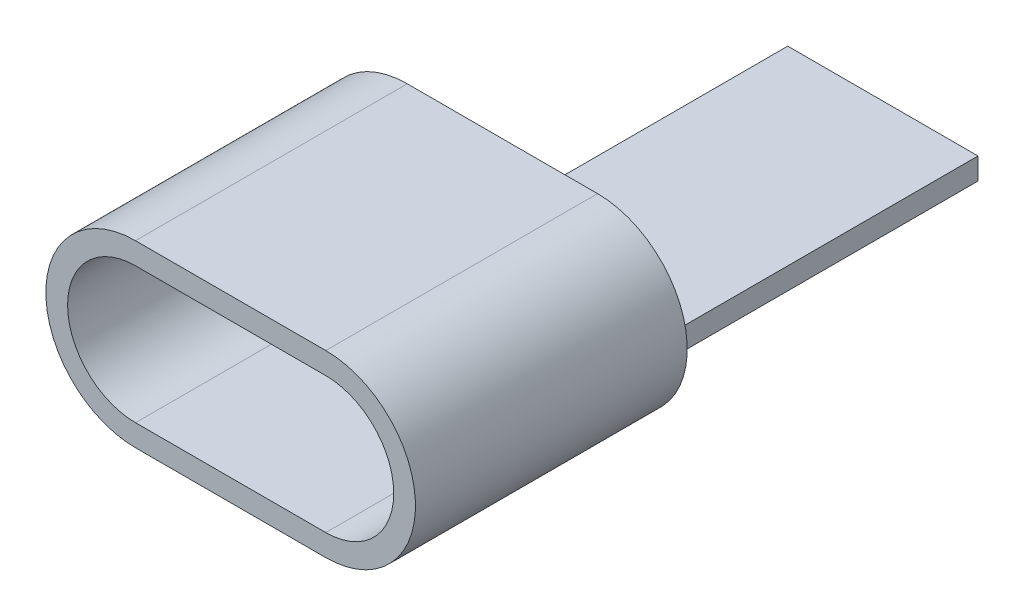
ISO-10303-21;
HEADER;
FILE_DESCRIPTION(('STEP AP214'),'2;1');
FILE_NAME('part.step','',(''),(''),'','','');
FILE_SCHEMA(('AUTOMOTIVE_DESIGN { 1 0 10303 214 1 1 1 1 }'));
ENDSEC;
DATA;
#1=APPLICATION_CONTEXT('core data for automotive mechanical design processes');
#2=APPLICATION_PROTOCOL_DEFINITION('international standard','automotive_design',2000,#1);
#3=PRODUCT_CONTEXT('',#1,'mechanical');
#4=PRODUCT('Part','Part','',(#3));
#5=PRODUCT_RELATED_PRODUCT_CATEGORY('part','',(#4));
#6=PRODUCT_DEFINITION_FORMATION('','',#4);
#7=PRODUCT_DEFINITION_CONTEXT('part definition',#1,'design');
#8=PRODUCT_DEFINITION('design','',#6,#7);
#9=PRODUCT_DEFINITION_SHAPE('','',#8);
#10=(LENGTH_UNIT() NAMED_UNIT(*) SI_UNIT(.MILLI.,.METRE.));
#11=(NAMED_UNIT(*) PLANE_ANGLE_UNIT() SI_UNIT($,.RADIAN.));
#12=(NAMED_UNIT(*) SI_UNIT($,.STERADIAN.) SOLID_ANGLE_UNIT());
#13=UNCERTAINTY_MEASURE_WITH_UNIT(LENGTH_MEASURE(1.E-05),#10,'distance_accuracy_value','');
#14=(GEOMETRIC_REPRESENTATION_CONTEXT(3) GLOBAL_UNCERTAINTY_ASSIGNED_CONTEXT((#13)) GLOBAL_UNIT_ASSIGNED_CONTEXT((#10,
#11,#12)) REPRESENTATION_CONTEXT('',''));
#15=CARTESIAN_POINT('',(0.,0.,0.));
#16=DIRECTION('',(0.,0.,1.));
#17=DIRECTION('',(1.,0.,0.));
#18=AXIS2_PLACEMENT_3D('',#15,#16,#17);
#19=CARTESIAN_POINT('',(-7.00000000000001,1.6,0.));
#20=DIRECTION('',(1.,0.,0.));
#21=DIRECTION('',(0.,0.,-1.));
#22=AXIS2_PLACEMENT_3D('',#19,#20,#21);
#23=PLANE('',#22);
#24=DIRECTION('',(0.,0.,1.));
#25=VECTOR('',#24,1.);
#26=CARTESIAN_POINT('',(-7.00000000000001,0.,0.));
#27=LINE('',#26,#25);
#28=CARTESIAN_POINT('',(-6.99999999999999,0.,-28.));
#29=VERTEX_POINT('',#28);
#30=CARTESIAN_POINT('',(-7.00000000000001,0.,0.));
#31=VERTEX_POINT('',#30);
#32=EDGE_CURVE('E174',#29,#31,#27,.T.);
#33=ORIENTED_EDGE('',*,*,#32,.T.);
#34=DIRECTION('',(0.,-1.,0.));
#35=VECTOR('',#34,1.);
#36=CARTESIAN_POINT('',(-7.00000000000001,1.6,0.));
#37=LINE('',#36,#35);
#38=CARTESIAN_POINT('',(-7.00000000000001,1.6,0.));
#39=VERTEX_POINT('',#38);
#40=EDGE_CURVE('E11',#39,#31,#37,.T.);
#41=ORIENTED_EDGE('',*,*,#40,.F.);
#42=DIRECTION('',(0.,0.,1.));
#43=VECTOR('',#42,1.);
#44=CARTESIAN_POINT('',(-7.00000000000001,1.6,0.));
#45=LINE('',#44,#43);
#46=CARTESIAN_POINT('',(-6.99999999999999,1.6,-28.));
#47=VERTEX_POINT('',#46);
#48=EDGE_CURVE('E83',#47,#39,#45,.T.);
#49=ORIENTED_EDGE('',*,*,#48,.F.);
#50=DIRECTION('',(0.,-1.,0.));
#51=VECTOR('',#50,1.);
#52=CARTESIAN_POINT('',(-6.99999999999999,1.6,-28.));
#53=LINE('',#52,#51);
#54=EDGE_CURVE('E173',#47,#29,#53,.T.);
#55=ORIENTED_EDGE('',*,*,#54,.T.);
#56=EDGE_LOOP('',(#33,#41,#49,#55));
#57=FACE_BOUND('',#56,.T.);
#58=ADVANCED_FACE('F41',(#57),#23,.F.);
#59=CARTESIAN_POINT('',(7.00000000000001,1.6,0.));
#60=DIRECTION('',(-1.,0.,0.));
#61=DIRECTION('',(0.,0.,1.));
#62=AXIS2_PLACEMENT_3D('',#59,#60,#61);
#63=PLANE('',#62);
#64=DIRECTION('',(0.,0.,-1.));
#65=VECTOR('',#64,1.);
#66=CARTESIAN_POINT('',(7.00000000000001,0.,0.));
#67=LINE('',#66,#65);
#68=CARTESIAN_POINT('',(7.00000000000001,0.,0.));
#69=VERTEX_POINT('',#68);
#70=CARTESIAN_POINT('',(7.00000000000001,0.,-28.));
#71=VERTEX_POINT('',#70);
#72=EDGE_CURVE('E72',#69,#71,#67,.T.);
#73=ORIENTED_EDGE('',*,*,#72,.T.);
#74=DIRECTION('',(0.,-1.,0.));
#75=VECTOR('',#74,1.);
#76=CARTESIAN_POINT('',(7.00000000000001,1.6,-28.));
#77=LINE('',#76,#75);
#78=CARTESIAN_POINT('',(7.00000000000001,1.6,-28.));
#79=VERTEX_POINT('',#78);
#80=EDGE_CURVE('E184',#79,#71,#77,.T.);
#81=ORIENTED_EDGE('',*,*,#80,.F.);
#82=DIRECTION('',(0.,0.,-1.));
#83=VECTOR('',#82,1.);
#84=CARTESIAN_POINT('',(7.00000000000001,1.6,0.));
#85=LINE('',#84,#83);
#86=CARTESIAN_POINT('',(7.00000000000001,1.6,0.));
#87=VERTEX_POINT('',#86);
#88=EDGE_CURVE('E168',#87,#79,#85,.T.);
#89=ORIENTED_EDGE('',*,*,#88,.F.);
#90=DIRECTION('',(0.,-1.,0.));
#91=VECTOR('',#90,1.);
#92=CARTESIAN_POINT('',(7.00000000000001,1.6,0.));
#93=LINE('',#92,#91);
#94=EDGE_CURVE('E50',#87,#69,#93,.T.);
#95=ORIENTED_EDGE('',*,*,#94,.T.);
#96=EDGE_LOOP('',(#73,#81,#89,#95));
#97=FACE_BOUND('',#96,.T.);
#98=ADVANCED_FACE('F188',(#97),#63,.F.);
#99=CARTESIAN_POINT('',(-6.99999999999999,1.6,-28.));
#100=DIRECTION('',(0.,0.,1.));
#101=DIRECTION('',(1.,0.,0.));
#102=AXIS2_PLACEMENT_3D('',#99,#100,#101);
#103=PLANE('',#102);
#104=DIRECTION('',(-1.,0.,0.));
#105=VECTOR('',#104,1.);
#106=CARTESIAN_POINT('',(-6.99999999999999,0.,-28.));
#107=LINE('',#106,#105);
#108=EDGE_CURVE('E78',#71,#29,#107,.T.);
#109=ORIENTED_EDGE('',*,*,#108,.T.);
#110=ORIENTED_EDGE('',*,*,#54,.F.);
#111=DIRECTION('',(-1.,0.,0.));
#112=VECTOR('',#111,1.);
#113=CARTESIAN_POINT('',(-6.99999999999999,1.6,-28.));
#114=LINE('',#113,#112);
#115=EDGE_CURVE('E58',#79,#47,#114,.T.);
#116=ORIENTED_EDGE('',*,*,#115,.F.);
#117=ORIENTED_EDGE('',*,*,#80,.T.);
#118=EDGE_LOOP('',(#109,#110,#116,#117));
#119=FACE_BOUND('',#118,.T.);
#120=ADVANCED_FACE('F265',(#119),#103,.F.);
#121=CARTESIAN_POINT('',(0.,1.6,0.));
#122=DIRECTION('',(0.,-1.,0.));
#123=DIRECTION('',(0.,0.,-1.));
#124=AXIS2_PLACEMENT_3D('',#121,#122,#123);
#125=PLANE('',#124);
#126=ORIENTED_EDGE('',*,*,#48,.T.);
#127=DIRECTION('',(0.,0.,-1.));
#128=VECTOR('',#127,1.);
#129=CARTESIAN_POINT('',(-7.00000000000001,1.6,20.));
#130=LINE('',#129,#128);
#131=CARTESIAN_POINT('',(-7.00000000000001,1.6,20.));
#132=VERTEX_POINT('',#131);
#133=EDGE_CURVE('E177',#132,#39,#130,.T.);
#134=ORIENTED_EDGE('',*,*,#133,.F.);
#135=DIRECTION('',(1.,0.,0.));
#136=VECTOR('',#135,1.);
#137=CARTESIAN_POINT('',(0.,1.6,20.));
#138=LINE('',#137,#136);
#139=CARTESIAN_POINT('',(7.00000000000001,1.6,20.));
#140=VERTEX_POINT('',#139);
#141=EDGE_CURVE('E234',#132,#140,#138,.T.);
#142=ORIENTED_EDGE('',*,*,#141,.T.);
#143=DIRECTION('',(0.,0.,-1.));
#144=VECTOR('',#143,1.);
#145=CARTESIAN_POINT('',(7.00000000000001,1.6,20.));
#146=LINE('',#145,#144);
#147=EDGE_CURVE('E155',#140,#87,#146,.T.);
#148=ORIENTED_EDGE('',*,*,#147,.T.);
#149=ORIENTED_EDGE('',*,*,#88,.T.);
#150=ORIENTED_EDGE('',*,*,#115,.T.);
#151=EDGE_LOOP('',(#126,#134,#142,#148,#149,#150));
#152=FACE_BOUND('',#151,.T.);
#153=ADVANCED_FACE('F264',(#152),#125,.F.);
#154=CARTESIAN_POINT('',(0.,0.,0.));
#155=DIRECTION('',(0.,-1.,0.));
#156=DIRECTION('',(0.,0.,-1.));
#157=AXIS2_PLACEMENT_3D('',#154,#155,#156);
#158=PLANE('',#157);
#159=ORIENTED_EDGE('',*,*,#32,.F.);
#160=ORIENTED_EDGE('',*,*,#108,.F.);
#161=ORIENTED_EDGE('',*,*,#72,.F.);
#162=DIRECTION('',(0.,0.,-1.));
#163=VECTOR('',#162,1.);
#164=CARTESIAN_POINT('',(7.00000000000001,0.,20.));
#165=LINE('',#164,#163);
#166=CARTESIAN_POINT('',(7.00000000000001,0.,20.));
#167=VERTEX_POINT('',#166);
#168=EDGE_CURVE('E134',#167,#69,#165,.T.);
#169=ORIENTED_EDGE('',*,*,#168,.F.);
#170=DIRECTION('',(1.,0.,0.));
#171=VECTOR('',#170,1.);
#172=CARTESIAN_POINT('',(0.,0.,20.));
#173=LINE('',#172,#171);
#174=CARTESIAN_POINT('',(-7.00000000000001,0.,20.));
#175=VERTEX_POINT('',#174);
#176=EDGE_CURVE('E126',#175,#167,#173,.T.);
#177=ORIENTED_EDGE('',*,*,#176,.F.);
#178=DIRECTION('',(0.,0.,-1.));
#179=VECTOR('',#178,1.);
#180=CARTESIAN_POINT('',(-7.00000000000001,0.,20.));
#181=LINE('',#180,#179);
#182=EDGE_CURVE('E131',#175,#31,#181,.T.);
#183=ORIENTED_EDGE('',*,*,#182,.T.);
#184=EDGE_LOOP('',(#159,#160,#161,#169,#177,#183));
#185=FACE_BOUND('',#184,.T.);
#186=ADVANCED_FACE('F129',(#185),#158,.T.);
#187=CARTESIAN_POINT('',(0.,0.,0.));
#188=DIRECTION('',(0.,0.,1.));
#189=DIRECTION('',(1.,0.,0.));
#190=AXIS2_PLACEMENT_3D('',#187,#188,#189);
#191=PLANE('',#190);
#192=ORIENTED_EDGE('',*,*,#94,.F.);
#193=CARTESIAN_POINT('',(7.00000000000001,6.6,0.));
#194=DIRECTION('',(0.,0.,1.));
#195=DIRECTION('',(1.,0.,0.));
#196=AXIS2_PLACEMENT_3D('',#193,#194,#195);
#197=CIRCLE('',#196,5.);
#198=CARTESIAN_POINT('',(7.00000000000001,11.6,0.));
#199=VERTEX_POINT('',#198);
#200=EDGE_CURVE('E149',#87,#199,#197,.T.);
#201=ORIENTED_EDGE('',*,*,#200,.T.);
#202=DIRECTION('',(1.,0.,0.));
#203=VECTOR('',#202,1.);
#204=CARTESIAN_POINT('',(0.,11.6,0.));
#205=LINE('',#204,#203);
#206=CARTESIAN_POINT('',(-7.00000000000001,11.6,0.));
#207=VERTEX_POINT('',#206);
#208=EDGE_CURVE('E213',#207,#199,#205,.T.);
#209=ORIENTED_EDGE('',*,*,#208,.F.);
#210=CARTESIAN_POINT('',(-7.00000000000001,6.6,0.));
#211=DIRECTION('',(0.,0.,1.));
#212=DIRECTION('',(1.,0.,0.));
#213=AXIS2_PLACEMENT_3D('',#210,#211,#212);
#214=CIRCLE('',#213,5.);
#215=EDGE_CURVE('E205',#207,#39,#214,.T.);
#216=ORIENTED_EDGE('',*,*,#215,.T.);
#217=ORIENTED_EDGE('',*,*,#40,.T.);
#218=CARTESIAN_POINT('',(-7.00000000000001,6.6,0.));
#219=DIRECTION('',(0.,0.,1.));
#220=DIRECTION('',(1.,0.,0.));
#221=AXIS2_PLACEMENT_3D('',#218,#219,#220);
#222=CIRCLE('',#221,6.6);
#223=CARTESIAN_POINT('',(-7.00000000000001,13.2,0.));
#224=VERTEX_POINT('',#223);
#225=EDGE_CURVE('E153',#224,#31,#222,.T.);
#226=ORIENTED_EDGE('',*,*,#225,.F.);
#227=DIRECTION('',(1.,0.,0.));
#228=VECTOR('',#227,1.);
#229=CARTESIAN_POINT('',(0.,13.2,0.));
#230=LINE('',#229,#228);
#231=CARTESIAN_POINT('',(7.00000000000001,13.2,0.));
#232=VERTEX_POINT('',#231);
#233=EDGE_CURVE('E200',#224,#232,#230,.T.);
#234=ORIENTED_EDGE('',*,*,#233,.T.);
#235=CARTESIAN_POINT('',(7.00000000000001,6.6,0.));
#236=DIRECTION('',(0.,0.,1.));
#237=DIRECTION('',(1.,0.,0.));
#238=AXIS2_PLACEMENT_3D('',#235,#236,#237);
#239=CIRCLE('',#238,6.6);
#240=EDGE_CURVE('E196',#69,#232,#239,.T.);
#241=ORIENTED_EDGE('',*,*,#240,.F.);
#242=EDGE_LOOP('',(#192,#201,#209,#216,#217,#226,#234,#241));
#243=FACE_BOUND('',#242,.T.);
#244=ADVANCED_FACE('F198',(#243),#191,.F.);
#245=CARTESIAN_POINT('',(-7.00000000000001,6.6,20.));
#246=DIRECTION('',(0.,0.,-1.));
#247=DIRECTION('',(-1.,0.,0.));
#248=AXIS2_PLACEMENT_3D('',#245,#246,#247);
#249=CYLINDRICAL_SURFACE('',#248,5.);
#250=ORIENTED_EDGE('',*,*,#215,.F.);
#251=DIRECTION('',(0.,0.,-1.));
#252=VECTOR('',#251,1.);
#253=CARTESIAN_POINT('',(-7.00000000000001,11.6,20.));
#254=LINE('',#253,#252);
#255=CARTESIAN_POINT('',(-7.00000000000001,11.6,20.));
#256=VERTEX_POINT('',#255);
#257=EDGE_CURVE('E221',#256,#207,#254,.T.);
#258=ORIENTED_EDGE('',*,*,#257,.F.);
#259=CARTESIAN_POINT('',(-7.00000000000001,6.6,20.));
#260=DIRECTION('',(0.,0.,1.));
#261=DIRECTION('',(1.,0.,0.));
#262=AXIS2_PLACEMENT_3D('',#259,#260,#261);
#263=CIRCLE('',#262,5.);
#264=EDGE_CURVE('E239',#256,#132,#263,.T.);
#265=ORIENTED_EDGE('',*,*,#264,.T.);
#266=ORIENTED_EDGE('',*,*,#133,.T.);
#267=EDGE_LOOP('',(#250,#258,#265,#266));
#268=FACE_BOUND('',#267,.T.);
#269=ADVANCED_FACE('F263',(#268),#249,.F.);
#270=CARTESIAN_POINT('',(0.,11.6,20.));
#271=DIRECTION('',(0.,1.,0.));
#272=DIRECTION('',(0.,0.,1.));
#273=AXIS2_PLACEMENT_3D('',#270,#271,#272);
#274=PLANE('',#273);
#275=ORIENTED_EDGE('',*,*,#208,.T.);
#276=DIRECTION('',(0.,0.,-1.));
#277=VECTOR('',#276,1.);
#278=CARTESIAN_POINT('',(7.00000000000001,11.6,20.));
#279=LINE('',#278,#277);
#280=CARTESIAN_POINT('',(7.00000000000001,11.6,20.));
#281=VERTEX_POINT('',#280);
#282=EDGE_CURVE('E160',#281,#199,#279,.T.);
#283=ORIENTED_EDGE('',*,*,#282,.F.);
#284=DIRECTION('',(1.,0.,0.));
#285=VECTOR('',#284,1.);
#286=CARTESIAN_POINT('',(0.,11.6,20.));
#287=LINE('',#286,#285);
#288=EDGE_CURVE('E246',#256,#281,#287,.T.);
#289=ORIENTED_EDGE('',*,*,#288,.F.);
#290=ORIENTED_EDGE('',*,*,#257,.T.);
#291=EDGE_LOOP('',(#275,#283,#289,#290));
#292=FACE_BOUND('',#291,.T.);
#293=ADVANCED_FACE('F259',(#292),#274,.F.);
#294=CARTESIAN_POINT('',(-7.00000000000001,6.6,20.));
#295=DIRECTION('',(0.,0.,-1.));
#296=DIRECTION('',(-1.,0.,0.));
#297=AXIS2_PLACEMENT_3D('',#294,#295,#296);
#298=CYLINDRICAL_SURFACE('',#297,6.6);
#299=ORIENTED_EDGE('',*,*,#225,.T.);
#300=ORIENTED_EDGE('',*,*,#182,.F.);
#301=CARTESIAN_POINT('',(-7.00000000000001,6.6,20.));
#302=DIRECTION('',(0.,0.,1.));
#303=DIRECTION('',(1.,0.,0.));
#304=AXIS2_PLACEMENT_3D('',#301,#302,#303);
#305=CIRCLE('',#304,6.6);
#306=CARTESIAN_POINT('',(-7.00000000000001,13.2,20.));
#307=VERTEX_POINT('',#306);
#308=EDGE_CURVE('E139',#307,#175,#305,.T.);
#309=ORIENTED_EDGE('',*,*,#308,.F.);
#310=DIRECTION('',(0.,0.,-1.));
#311=VECTOR('',#310,1.);
#312=CARTESIAN_POINT('',(-7.00000000000001,13.2,20.));
#313=LINE('',#312,#311);
#314=EDGE_CURVE('E227',#307,#224,#313,.T.);
#315=ORIENTED_EDGE('',*,*,#314,.T.);
#316=EDGE_LOOP('',(#299,#300,#309,#315));
#317=FACE_BOUND('',#316,.T.);
#318=ADVANCED_FACE('F151',(#317),#298,.T.);
#319=CARTESIAN_POINT('',(7.00000000000001,6.6,20.));
#320=DIRECTION('',(0.,0.,-1.));
#321=DIRECTION('',(-1.,0.,0.));
#322=AXIS2_PLACEMENT_3D('',#319,#320,#321);
#323=CYLINDRICAL_SURFACE('',#322,6.6);
#324=ORIENTED_EDGE('',*,*,#240,.T.);
#325=DIRECTION('',(0.,0.,-1.));
#326=VECTOR('',#325,1.);
#327=CARTESIAN_POINT('',(7.00000000000001,13.2,20.));
#328=LINE('',#327,#326);
#329=CARTESIAN_POINT('',(7.00000000000001,13.2,20.));
#330=VERTEX_POINT('',#329);
#331=EDGE_CURVE('E162',#330,#232,#328,.T.);
#332=ORIENTED_EDGE('',*,*,#331,.F.);
#333=CARTESIAN_POINT('',(7.00000000000001,6.6,20.));
#334=DIRECTION('',(0.,0.,1.));
#335=DIRECTION('',(1.,0.,0.));
#336=AXIS2_PLACEMENT_3D('',#333,#334,#335);
#337=CIRCLE('',#336,6.6);
#338=EDGE_CURVE('E138',#167,#330,#337,.T.);
#339=ORIENTED_EDGE('',*,*,#338,.F.);
#340=ORIENTED_EDGE('',*,*,#168,.T.);
#341=EDGE_LOOP('',(#324,#332,#339,#340));
#342=FACE_BOUND('',#341,.T.);
#343=ADVANCED_FACE('F194',(#342),#323,.T.);
#344=CARTESIAN_POINT('',(0.,13.2,20.));
#345=DIRECTION('',(0.,1.,0.));
#346=DIRECTION('',(0.,0.,1.));
#347=AXIS2_PLACEMENT_3D('',#344,#345,#346);
#348=PLANE('',#347);
#349=ORIENTED_EDGE('',*,*,#233,.F.);
#350=ORIENTED_EDGE('',*,*,#314,.F.);
#351=DIRECTION('',(1.,0.,0.));
#352=VECTOR('',#351,1.);
#353=CARTESIAN_POINT('',(0.,13.2,20.));
#354=LINE('',#353,#352);
#355=EDGE_CURVE('E146',#307,#330,#354,.T.);
#356=ORIENTED_EDGE('',*,*,#355,.T.);
#357=ORIENTED_EDGE('',*,*,#331,.T.);
#358=EDGE_LOOP('',(#349,#350,#356,#357));
#359=FACE_BOUND('',#358,.T.);
#360=ADVANCED_FACE('F232',(#359),#348,.T.);
#361=CARTESIAN_POINT('',(7.00000000000001,6.6,20.));
#362=DIRECTION('',(0.,0.,-1.));
#363=DIRECTION('',(-1.,0.,0.));
#364=AXIS2_PLACEMENT_3D('',#361,#362,#363);
#365=CYLINDRICAL_SURFACE('',#364,5.);
#366=ORIENTED_EDGE('',*,*,#200,.F.);
#367=ORIENTED_EDGE('',*,*,#147,.F.);
#368=CARTESIAN_POINT('',(7.00000000000001,6.6,20.));
#369=DIRECTION('',(0.,0.,1.));
#370=DIRECTION('',(1.,0.,0.));
#371=AXIS2_PLACEMENT_3D('',#368,#369,#370);
#372=CIRCLE('',#371,5.);
#373=EDGE_CURVE('E229',#140,#281,#372,.T.);
#374=ORIENTED_EDGE('',*,*,#373,.T.);
#375=ORIENTED_EDGE('',*,*,#282,.T.);
#376=EDGE_LOOP('',(#366,#367,#374,#375));
#377=FACE_BOUND('',#376,.T.);
#378=ADVANCED_FACE('F253',(#377),#365,.F.);
#379=CARTESIAN_POINT('',(0.,0.,20.));
#380=DIRECTION('',(0.,0.,1.));
#381=DIRECTION('',(1.,0.,0.));
#382=AXIS2_PLACEMENT_3D('',#379,#380,#381);
#383=PLANE('',#382);
#384=ORIENTED_EDGE('',*,*,#308,.T.);
#385=ORIENTED_EDGE('',*,*,#176,.T.);
#386=ORIENTED_EDGE('',*,*,#338,.T.);
#387=ORIENTED_EDGE('',*,*,#355,.F.);
#388=EDGE_LOOP('',(#384,#385,#386,#387));
#389=FACE_BOUND('',#388,.T.);
#390=ORIENTED_EDGE('',*,*,#141,.F.);
#391=ORIENTED_EDGE('',*,*,#264,.F.);
#392=ORIENTED_EDGE('',*,*,#288,.T.);
#393=ORIENTED_EDGE('',*,*,#373,.F.);
#394=EDGE_LOOP('',(#390,#391,#392,#393));
#395=FACE_BOUND('',#394,.T.);
#396=ADVANCED_FACE('F143',(#389,#395),#383,.T.);
#397=CLOSED_SHELL('',(#58,#98,#120,#153,#186,#244,#269,#293,#318,#343,#360,#378,#396));
#398=MANIFOLD_SOLID_BREP('B2',#397);
#399=ADVANCED_BREP_SHAPE_REPRESENTATION('',(#18,#398),#14);
#400=SHAPE_DEFINITION_REPRESENTATION(#9,#399);
ENDSEC;
END-ISO-10303-21;
